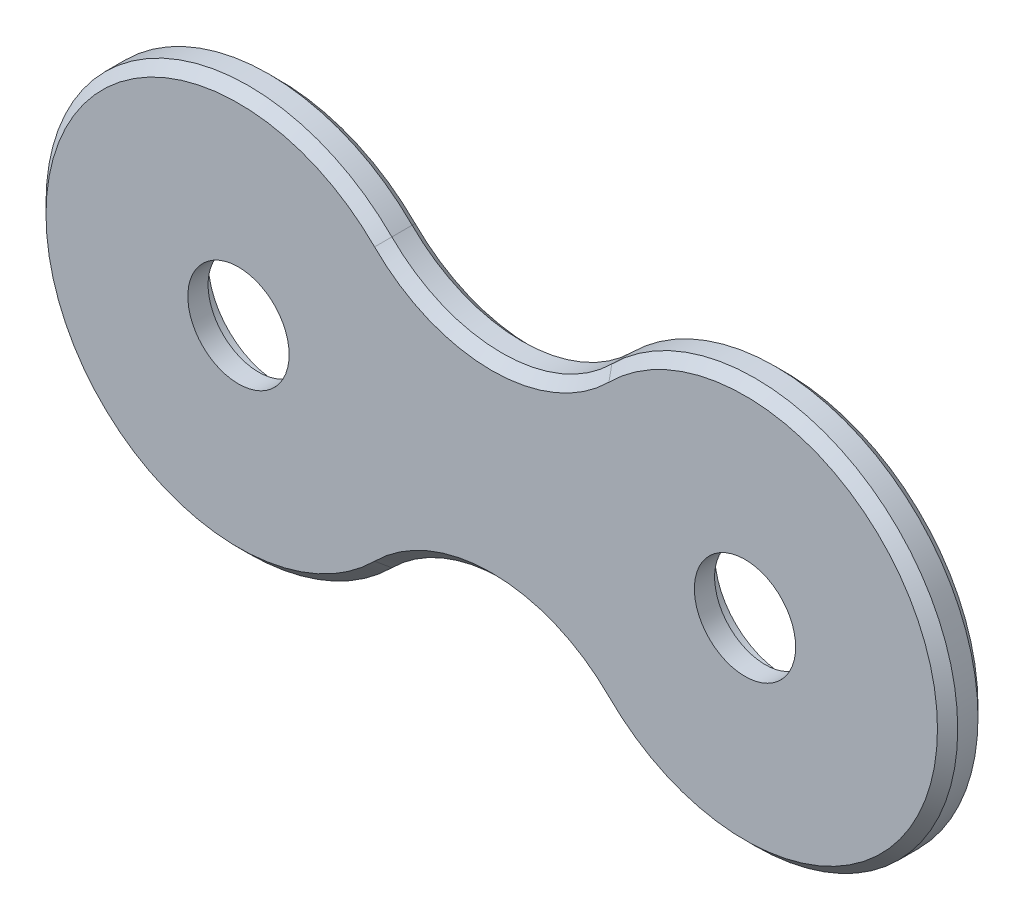
ISO-10303-21;
HEADER;
FILE_DESCRIPTION(('STEP AP214'),'2;1');
FILE_NAME('part.step','',(''),(''),'','','');
FILE_SCHEMA(('AUTOMOTIVE_DESIGN { 1 0 10303 214 1 1 1 1 }'));
ENDSEC;
DATA;
#1=APPLICATION_CONTEXT('core data for automotive mechanical design processes');
#2=APPLICATION_PROTOCOL_DEFINITION('international standard','automotive_design',2000,#1);
#3=PRODUCT_CONTEXT('',#1,'mechanical');
#4=PRODUCT('Part','Part','',(#3));
#5=PRODUCT_RELATED_PRODUCT_CATEGORY('part','',(#4));
#6=PRODUCT_DEFINITION_FORMATION('','',#4);
#7=PRODUCT_DEFINITION_CONTEXT('part definition',#1,'design');
#8=PRODUCT_DEFINITION('design','',#6,#7);
#9=PRODUCT_DEFINITION_SHAPE('','',#8);
#10=(LENGTH_UNIT() NAMED_UNIT(*) SI_UNIT(.MILLI.,.METRE.));
#11=(NAMED_UNIT(*) PLANE_ANGLE_UNIT() SI_UNIT($,.RADIAN.));
#12=(NAMED_UNIT(*) SI_UNIT($,.STERADIAN.) SOLID_ANGLE_UNIT());
#13=UNCERTAINTY_MEASURE_WITH_UNIT(LENGTH_MEASURE(1.E-05),#10,'distance_accuracy_value','');
#14=(GEOMETRIC_REPRESENTATION_CONTEXT(3) GLOBAL_UNCERTAINTY_ASSIGNED_CONTEXT((#13)) GLOBAL_UNIT_ASSIGNED_CONTEXT((#10,
#11,#12)) REPRESENTATION_CONTEXT('',''));
#15=CARTESIAN_POINT('',(0.,0.,0.));
#16=DIRECTION('',(0.,0.,1.));
#17=DIRECTION('',(1.,0.,0.));
#18=AXIS2_PLACEMENT_3D('',#15,#16,#17);
#19=CARTESIAN_POINT('',(18.75,6.25,0.));
#20=DIRECTION('',(0.,0.,1.));
#21=DIRECTION('',(1.,0.,0.));
#22=AXIS2_PLACEMENT_3D('',#19,#20,#21);
#23=PLANE('',#22);
#24=CARTESIAN_POINT('',(0.,0.,0.));
#25=DIRECTION('',(0.,0.,1.));
#26=DIRECTION('',(1.,0.,0.));
#27=AXIS2_PLACEMENT_3D('',#24,#25,#26);
#28=CIRCLE('',#27,3.5);
#29=CARTESIAN_POINT('',(3.5,0.,0.));
#30=VERTEX_POINT('',#29);
#31=EDGE_CURVE('E174',#30,#30,#28,.T.);
#32=ORIENTED_EDGE('',*,*,#31,.T.);
#33=EDGE_LOOP('',(#32));
#34=FACE_BOUND('',#33,.T.);
#35=CARTESIAN_POINT('',(12.5,-12.5,0.));
#36=DIRECTION('',(0.,0.,1.));
#37=DIRECTION('',(1.,0.,0.));
#38=AXIS2_PLACEMENT_3D('',#35,#36,#37);
#39=CIRCLE('',#38,8.17766952966369);
#40=CARTESIAN_POINT('',(18.2824855787278,-6.7175144212722,0.));
#41=VERTEX_POINT('',#40);
#42=CARTESIAN_POINT('',(6.7175144212722,-6.7175144212722,0.));
#43=VERTEX_POINT('',#42);
#44=EDGE_CURVE('E42',#41,#43,#39,.T.);
#45=ORIENTED_EDGE('',*,*,#44,.T.);
#46=CARTESIAN_POINT('',(0.,0.,0.));
#47=DIRECTION('',(0.,0.,1.));
#48=DIRECTION('',(1.,0.,0.));
#49=AXIS2_PLACEMENT_3D('',#46,#47,#48);
#50=CIRCLE('',#49,9.49999999999999);
#51=CARTESIAN_POINT('',(6.7175144212722,6.7175144212722,0.));
#52=VERTEX_POINT('',#51);
#53=EDGE_CURVE('E11',#43,#52,#50,.F.);
#54=ORIENTED_EDGE('',*,*,#53,.T.);
#55=CARTESIAN_POINT('',(12.5,12.5,0.));
#56=DIRECTION('',(0.,0.,1.));
#57=DIRECTION('',(1.,0.,0.));
#58=AXIS2_PLACEMENT_3D('',#55,#56,#57);
#59=CIRCLE('',#58,8.17766952966369);
#60=CARTESIAN_POINT('',(18.2824855787278,6.7175144212722,0.));
#61=VERTEX_POINT('',#60);
#62=EDGE_CURVE('E151',#52,#61,#59,.T.);
#63=ORIENTED_EDGE('',*,*,#62,.T.);
#64=CARTESIAN_POINT('',(25.,0.,0.));
#65=DIRECTION('',(0.,0.,1.));
#66=DIRECTION('',(1.,0.,0.));
#67=AXIS2_PLACEMENT_3D('',#64,#65,#66);
#68=CIRCLE('',#67,9.49999999999999);
#69=EDGE_CURVE('E53',#61,#41,#68,.F.);
#70=ORIENTED_EDGE('',*,*,#69,.T.);
#71=EDGE_LOOP('',(#45,#54,#63,#70));
#72=FACE_BOUND('',#71,.T.);
#73=CARTESIAN_POINT('',(25.,0.,0.));
#74=DIRECTION('',(0.,0.,1.));
#75=DIRECTION('',(1.,0.,0.));
#76=AXIS2_PLACEMENT_3D('',#73,#74,#75);
#77=CIRCLE('',#76,3.5);
#78=CARTESIAN_POINT('',(28.5,0.,0.));
#79=VERTEX_POINT('',#78);
#80=EDGE_CURVE('E181',#79,#79,#77,.T.);
#81=ORIENTED_EDGE('',*,*,#80,.T.);
#82=EDGE_LOOP('',(#81));
#83=FACE_BOUND('',#82,.T.);
#84=ADVANCED_FACE('F33',(#34,#72,#83),#23,.F.);
#85=CARTESIAN_POINT('',(18.75,6.25,2.));
#86=DIRECTION('',(0.,0.,1.));
#87=DIRECTION('',(1.,0.,0.));
#88=AXIS2_PLACEMENT_3D('',#85,#86,#87);
#89=PLANE('',#88);
#90=CARTESIAN_POINT('',(12.5,12.5,2.));
#91=DIRECTION('',(0.,0.,1.));
#92=DIRECTION('',(1.,0.,0.));
#93=AXIS2_PLACEMENT_3D('',#90,#91,#92);
#94=CIRCLE('',#93,8.17766952966369);
#95=CARTESIAN_POINT('',(18.2824855787278,6.71751442127221,2.));
#96=VERTEX_POINT('',#95);
#97=CARTESIAN_POINT('',(6.7175144212722,6.7175144212722,2.));
#98=VERTEX_POINT('',#97);
#99=EDGE_CURVE('E103',#96,#98,#94,.F.);
#100=ORIENTED_EDGE('',*,*,#99,.T.);
#101=CARTESIAN_POINT('',(0.,0.,2.));
#102=DIRECTION('',(0.,0.,1.));
#103=DIRECTION('',(1.,0.,0.));
#104=AXIS2_PLACEMENT_3D('',#101,#102,#103);
#105=CIRCLE('',#104,9.5);
#106=CARTESIAN_POINT('',(6.7175144212722,-6.7175144212722,2.));
#107=VERTEX_POINT('',#106);
#108=EDGE_CURVE('E132',#98,#107,#105,.T.);
#109=ORIENTED_EDGE('',*,*,#108,.T.);
#110=CARTESIAN_POINT('',(12.5,-12.5,2.));
#111=DIRECTION('',(0.,0.,1.));
#112=DIRECTION('',(1.,0.,0.));
#113=AXIS2_PLACEMENT_3D('',#110,#111,#112);
#114=CIRCLE('',#113,8.17766952966369);
#115=CARTESIAN_POINT('',(18.2824855787278,-6.7175144212722,2.));
#116=VERTEX_POINT('',#115);
#117=EDGE_CURVE('E106',#107,#116,#114,.F.);
#118=ORIENTED_EDGE('',*,*,#117,.T.);
#119=CARTESIAN_POINT('',(25.,0.,2.));
#120=DIRECTION('',(0.,0.,1.));
#121=DIRECTION('',(1.,0.,0.));
#122=AXIS2_PLACEMENT_3D('',#119,#120,#121);
#123=CIRCLE('',#122,9.50000000000001);
#124=EDGE_CURVE('E97',#116,#96,#123,.T.);
#125=ORIENTED_EDGE('',*,*,#124,.T.);
#126=EDGE_LOOP('',(#100,#109,#118,#125));
#127=FACE_BOUND('',#126,.T.);
#128=CARTESIAN_POINT('',(25.,0.,2.));
#129=DIRECTION('',(0.,0.,1.));
#130=DIRECTION('',(1.,0.,0.));
#131=AXIS2_PLACEMENT_3D('',#128,#129,#130);
#132=CIRCLE('',#131,2.5);
#133=CARTESIAN_POINT('',(27.5,0.,2.));
#134=VERTEX_POINT('',#133);
#135=EDGE_CURVE('E186',#134,#134,#132,.T.);
#136=ORIENTED_EDGE('',*,*,#135,.F.);
#137=EDGE_LOOP('',(#136));
#138=FACE_BOUND('',#137,.T.);
#139=CARTESIAN_POINT('',(0.,0.,2.));
#140=DIRECTION('',(0.,0.,1.));
#141=DIRECTION('',(1.,0.,0.));
#142=AXIS2_PLACEMENT_3D('',#139,#140,#141);
#143=CIRCLE('',#142,2.5);
#144=CARTESIAN_POINT('',(2.5,0.,2.));
#145=VERTEX_POINT('',#144);
#146=EDGE_CURVE('E118',#145,#145,#143,.T.);
#147=ORIENTED_EDGE('',*,*,#146,.F.);
#148=EDGE_LOOP('',(#147));
#149=FACE_BOUND('',#148,.T.);
#150=ADVANCED_FACE('F99',(#127,#138,#149),#89,.T.);
#151=CARTESIAN_POINT('',(12.5,12.5,2.));
#152=DIRECTION('',(0.,0.,-1.));
#153=DIRECTION('',(-1.,0.,0.));
#154=AXIS2_PLACEMENT_3D('',#151,#152,#153);
#155=CYLINDRICAL_SURFACE('',#154,7.67766952966369);
#156=DIRECTION('',(0.,0.,-1.));
#157=VECTOR('',#156,1.);
#158=CARTESIAN_POINT('',(7.07106781186547,7.07106781186547,2.));
#159=LINE('',#158,#157);
#160=CARTESIAN_POINT('',(7.07106781186547,7.07106781186547,1.50000000000001));
#161=VERTEX_POINT('',#160);
#162=CARTESIAN_POINT('',(7.07106781186547,7.07106781186547,0.500000000000001));
#163=VERTEX_POINT('',#162);
#164=EDGE_CURVE('E124',#161,#163,#159,.T.);
#165=ORIENTED_EDGE('',*,*,#164,.F.);
#166=CARTESIAN_POINT('',(12.5,12.5,1.50000000000001));
#167=DIRECTION('',(0.,0.,1.));
#168=DIRECTION('',(1.,0.,0.));
#169=AXIS2_PLACEMENT_3D('',#166,#167,#168);
#170=CIRCLE('',#169,7.67766952966369);
#171=CARTESIAN_POINT('',(17.9289321881345,7.07106781186548,1.50000000000001));
#172=VERTEX_POINT('',#171);
#173=EDGE_CURVE('E149',#161,#172,#170,.T.);
#174=ORIENTED_EDGE('',*,*,#173,.T.);
#175=DIRECTION('',(0.,0.,-1.));
#176=VECTOR('',#175,1.);
#177=CARTESIAN_POINT('',(17.9289321881345,7.07106781186548,2.));
#178=LINE('',#177,#176);
#179=CARTESIAN_POINT('',(17.9289321881345,7.07106781186548,0.500000000000001));
#180=VERTEX_POINT('',#179);
#181=EDGE_CURVE('E189',#172,#180,#178,.T.);
#182=ORIENTED_EDGE('',*,*,#181,.T.);
#183=CARTESIAN_POINT('',(12.5,12.5,0.500000000000001));
#184=DIRECTION('',(0.,0.,1.));
#185=DIRECTION('',(1.,0.,0.));
#186=AXIS2_PLACEMENT_3D('',#183,#184,#185);
#187=CIRCLE('',#186,7.67766952966369);
#188=EDGE_CURVE('E147',#180,#163,#187,.F.);
#189=ORIENTED_EDGE('',*,*,#188,.T.);
#190=EDGE_LOOP('',(#165,#174,#182,#189));
#191=FACE_BOUND('',#190,.T.);
#192=ADVANCED_FACE('F225',(#191),#155,.F.);
#193=CARTESIAN_POINT('',(0.,0.,2.));
#194=DIRECTION('',(0.,0.,-1.));
#195=DIRECTION('',(-1.,0.,0.));
#196=AXIS2_PLACEMENT_3D('',#193,#194,#195);
#197=CYLINDRICAL_SURFACE('',#196,10.);
#198=DIRECTION('',(0.,0.,-1.));
#199=VECTOR('',#198,1.);
#200=CARTESIAN_POINT('',(7.07106781186547,-7.07106781186547,2.));
#201=LINE('',#200,#199);
#202=CARTESIAN_POINT('',(7.07106781186547,-7.07106781186547,1.50000000000001));
#203=VERTEX_POINT('',#202);
#204=CARTESIAN_POINT('',(7.07106781186547,-7.07106781186547,0.500000000000001));
#205=VERTEX_POINT('',#204);
#206=EDGE_CURVE('E127',#203,#205,#201,.T.);
#207=ORIENTED_EDGE('',*,*,#206,.F.);
#208=CARTESIAN_POINT('',(0.,0.,1.50000000000001));
#209=DIRECTION('',(0.,0.,1.));
#210=DIRECTION('',(1.,0.,0.));
#211=AXIS2_PLACEMENT_3D('',#208,#209,#210);
#212=CIRCLE('',#211,10.);
#213=EDGE_CURVE('E137',#203,#161,#212,.F.);
#214=ORIENTED_EDGE('',*,*,#213,.T.);
#215=ORIENTED_EDGE('',*,*,#164,.T.);
#216=CARTESIAN_POINT('',(0.,0.,0.500000000000001));
#217=DIRECTION('',(0.,0.,1.));
#218=DIRECTION('',(1.,0.,0.));
#219=AXIS2_PLACEMENT_3D('',#216,#217,#218);
#220=CIRCLE('',#219,10.);
#221=EDGE_CURVE('E134',#163,#205,#220,.T.);
#222=ORIENTED_EDGE('',*,*,#221,.T.);
#223=EDGE_LOOP('',(#207,#214,#215,#222));
#224=FACE_BOUND('',#223,.T.);
#225=ADVANCED_FACE('F203',(#224),#197,.T.);
#226=CARTESIAN_POINT('',(12.5,-12.5,2.));
#227=DIRECTION('',(0.,0.,-1.));
#228=DIRECTION('',(-1.,0.,0.));
#229=AXIS2_PLACEMENT_3D('',#226,#227,#228);
#230=CYLINDRICAL_SURFACE('',#229,7.67766952966369);
#231=DIRECTION('',(0.,0.,-1.));
#232=VECTOR('',#231,1.);
#233=CARTESIAN_POINT('',(17.9289321881345,-7.07106781186547,2.));
#234=LINE('',#233,#232);
#235=CARTESIAN_POINT('',(17.9289321881345,-7.07106781186547,1.50000000000001));
#236=VERTEX_POINT('',#235);
#237=CARTESIAN_POINT('',(17.9289321881345,-7.07106781186547,0.500000000000001));
#238=VERTEX_POINT('',#237);
#239=EDGE_CURVE('E192',#236,#238,#234,.T.);
#240=ORIENTED_EDGE('',*,*,#239,.F.);
#241=CARTESIAN_POINT('',(12.5,-12.5,1.50000000000001));
#242=DIRECTION('',(0.,0.,1.));
#243=DIRECTION('',(1.,0.,0.));
#244=AXIS2_PLACEMENT_3D('',#241,#242,#243);
#245=CIRCLE('',#244,7.67766952966369);
#246=EDGE_CURVE('E142',#236,#203,#245,.T.);
#247=ORIENTED_EDGE('',*,*,#246,.T.);
#248=ORIENTED_EDGE('',*,*,#206,.T.);
#249=CARTESIAN_POINT('',(12.5,-12.5,0.500000000000001));
#250=DIRECTION('',(0.,0.,1.));
#251=DIRECTION('',(1.,0.,0.));
#252=AXIS2_PLACEMENT_3D('',#249,#250,#251);
#253=CIRCLE('',#252,7.67766952966369);
#254=EDGE_CURVE('E140',#205,#238,#253,.F.);
#255=ORIENTED_EDGE('',*,*,#254,.T.);
#256=EDGE_LOOP('',(#240,#247,#248,#255));
#257=FACE_BOUND('',#256,.T.);
#258=ADVANCED_FACE('F198',(#257),#230,.F.);
#259=CARTESIAN_POINT('',(25.,0.,2.));
#260=DIRECTION('',(0.,0.,-1.));
#261=DIRECTION('',(-1.,0.,0.));
#262=AXIS2_PLACEMENT_3D('',#259,#260,#261);
#263=CYLINDRICAL_SURFACE('',#262,10.);
#264=ORIENTED_EDGE('',*,*,#181,.F.);
#265=CARTESIAN_POINT('',(25.,0.,1.50000000000001));
#266=DIRECTION('',(0.,0.,1.));
#267=DIRECTION('',(1.,0.,0.));
#268=AXIS2_PLACEMENT_3D('',#265,#266,#267);
#269=CIRCLE('',#268,10.);
#270=EDGE_CURVE('E115',#172,#236,#269,.F.);
#271=ORIENTED_EDGE('',*,*,#270,.T.);
#272=ORIENTED_EDGE('',*,*,#239,.T.);
#273=CARTESIAN_POINT('',(25.,0.,0.500000000000001));
#274=DIRECTION('',(0.,0.,1.));
#275=DIRECTION('',(1.,0.,0.));
#276=AXIS2_PLACEMENT_3D('',#273,#274,#275);
#277=CIRCLE('',#276,10.);
#278=EDGE_CURVE('E144',#238,#180,#277,.T.);
#279=ORIENTED_EDGE('',*,*,#278,.T.);
#280=EDGE_LOOP('',(#264,#271,#272,#279));
#281=FACE_BOUND('',#280,.T.);
#282=ADVANCED_FACE('F229',(#281),#263,.T.);
#283=CARTESIAN_POINT('',(25.,0.,2.));
#284=DIRECTION('',(0.,0.,-1.));
#285=DIRECTION('',(-1.,0.,0.));
#286=AXIS2_PLACEMENT_3D('',#283,#284,#285);
#287=CYLINDRICAL_SURFACE('',#286,2.5);
#288=CARTESIAN_POINT('',(25.,0.,1.));
#289=DIRECTION('',(0.,0.,1.));
#290=DIRECTION('',(1.,0.,0.));
#291=AXIS2_PLACEMENT_3D('',#288,#289,#290);
#292=CIRCLE('',#291,2.5);
#293=CARTESIAN_POINT('',(27.5,0.,1.));
#294=VERTEX_POINT('',#293);
#295=EDGE_CURVE('E37',#294,#294,#292,.T.);
#296=ORIENTED_EDGE('',*,*,#295,.F.);
#297=EDGE_LOOP('',(#296));
#298=FACE_BOUND('',#297,.T.);
#299=ORIENTED_EDGE('',*,*,#135,.T.);
#300=EDGE_LOOP('',(#299));
#301=FACE_BOUND('',#300,.T.);
#302=ADVANCED_FACE('F232',(#298,#301),#287,.F.);
#303=CARTESIAN_POINT('',(0.,0.,2.));
#304=DIRECTION('',(0.,0.,-1.));
#305=DIRECTION('',(-1.,0.,0.));
#306=AXIS2_PLACEMENT_3D('',#303,#304,#305);
#307=CYLINDRICAL_SURFACE('',#306,2.5);
#308=CARTESIAN_POINT('',(0.,0.,1.));
#309=DIRECTION('',(0.,0.,1.));
#310=DIRECTION('',(1.,0.,0.));
#311=AXIS2_PLACEMENT_3D('',#308,#309,#310);
#312=CIRCLE('',#311,2.5);
#313=CARTESIAN_POINT('',(2.5,0.,1.));
#314=VERTEX_POINT('',#313);
#315=EDGE_CURVE('E163',#314,#314,#312,.T.);
#316=ORIENTED_EDGE('',*,*,#315,.F.);
#317=EDGE_LOOP('',(#316));
#318=FACE_BOUND('',#317,.T.);
#319=ORIENTED_EDGE('',*,*,#146,.T.);
#320=EDGE_LOOP('',(#319));
#321=FACE_BOUND('',#320,.T.);
#322=ADVANCED_FACE('F269',(#318,#321),#307,.F.);
#323=CARTESIAN_POINT('',(25.,0.,2.));
#324=DIRECTION('',(0.,0.,-1.));
#325=DIRECTION('',(-1.,0.,0.));
#326=AXIS2_PLACEMENT_3D('',#323,#324,#325);
#327=CONICAL_SURFACE('',#326,9.50000000000001,0.785398163397448);
#328=DIRECTION('',(0.499999999999999,0.500000000000003,0.707106781186546));
#329=VECTOR('',#328,1.);
#330=CARTESIAN_POINT('',(17.9289321881345,-7.07106781186547,1.50000000000001));
#331=LINE('',#330,#329);
#332=EDGE_CURVE('E119',#236,#116,#331,.T.);
#333=ORIENTED_EDGE('',*,*,#332,.F.);
#334=ORIENTED_EDGE('',*,*,#270,.F.);
#335=DIRECTION('',(-0.5,0.500000000000001,-0.707106781186547));
#336=VECTOR('',#335,1.);
#337=CARTESIAN_POINT('',(18.2824855787278,6.71751442127221,2.));
#338=LINE('',#337,#336);
#339=EDGE_CURVE('E113',#96,#172,#338,.T.);
#340=ORIENTED_EDGE('',*,*,#339,.F.);
#341=ORIENTED_EDGE('',*,*,#124,.F.);
#342=EDGE_LOOP('',(#333,#334,#340,#341));
#343=FACE_BOUND('',#342,.T.);
#344=ADVANCED_FACE('F114',(#343),#327,.T.);
#345=CARTESIAN_POINT('',(12.5,12.5,2.));
#346=DIRECTION('',(0.,0.,1.));
#347=DIRECTION('',(1.,0.,0.));
#348=AXIS2_PLACEMENT_3D('',#345,#346,#347);
#349=CONICAL_SURFACE('',#348,8.17766952966369,0.785398163397451);
#350=ORIENTED_EDGE('',*,*,#339,.T.);
#351=ORIENTED_EDGE('',*,*,#173,.F.);
#352=DIRECTION('',(0.500000000000001,0.5,-0.707106781186546));
#353=VECTOR('',#352,1.);
#354=CARTESIAN_POINT('',(6.7175144212722,6.7175144212722,2.));
#355=LINE('',#354,#353);
#356=EDGE_CURVE('E122',#98,#161,#355,.T.);
#357=ORIENTED_EDGE('',*,*,#356,.F.);
#358=ORIENTED_EDGE('',*,*,#99,.F.);
#359=EDGE_LOOP('',(#350,#351,#357,#358));
#360=FACE_BOUND('',#359,.T.);
#361=ADVANCED_FACE('F121',(#360),#349,.F.);
#362=CARTESIAN_POINT('',(12.5,-12.5,2.));
#363=DIRECTION('',(0.,0.,1.));
#364=DIRECTION('',(1.,0.,0.));
#365=AXIS2_PLACEMENT_3D('',#362,#363,#364);
#366=CONICAL_SURFACE('',#365,8.17766952966369,0.785398163397449);
#367=ORIENTED_EDGE('',*,*,#332,.T.);
#368=ORIENTED_EDGE('',*,*,#117,.F.);
#369=DIRECTION('',(-0.500000000000001,0.5,0.707106781186547));
#370=VECTOR('',#369,1.);
#371=CARTESIAN_POINT('',(7.07106781186547,-7.07106781186547,1.50000000000001));
#372=LINE('',#371,#370);
#373=EDGE_CURVE('E155',#203,#107,#372,.T.);
#374=ORIENTED_EDGE('',*,*,#373,.F.);
#375=ORIENTED_EDGE('',*,*,#246,.F.);
#376=EDGE_LOOP('',(#367,#368,#374,#375));
#377=FACE_BOUND('',#376,.T.);
#378=ADVANCED_FACE('F210',(#377),#366,.F.);
#379=CARTESIAN_POINT('',(0.,0.,2.));
#380=DIRECTION('',(0.,0.,-1.));
#381=DIRECTION('',(-1.,0.,0.));
#382=AXIS2_PLACEMENT_3D('',#379,#380,#381);
#383=CONICAL_SURFACE('',#382,9.5,0.78539816339745);
#384=ORIENTED_EDGE('',*,*,#356,.T.);
#385=ORIENTED_EDGE('',*,*,#213,.F.);
#386=ORIENTED_EDGE('',*,*,#373,.T.);
#387=ORIENTED_EDGE('',*,*,#108,.F.);
#388=EDGE_LOOP('',(#384,#385,#386,#387));
#389=FACE_BOUND('',#388,.T.);
#390=ADVANCED_FACE('F208',(#389),#383,.T.);
#391=CARTESIAN_POINT('',(25.,0.,0.500000000000001));
#392=DIRECTION('',(0.,0.,1.));
#393=DIRECTION('',(1.,0.,0.));
#394=AXIS2_PLACEMENT_3D('',#391,#392,#393);
#395=CONICAL_SURFACE('',#394,10.,0.785398163397451);
#396=DIRECTION('',(-0.500000000000001,-0.500000000000001,0.707106781186546));
#397=VECTOR('',#396,1.);
#398=CARTESIAN_POINT('',(18.2824855787278,-6.7175144212722,0.));
#399=LINE('',#398,#397);
#400=EDGE_CURVE('E165',#41,#238,#399,.T.);
#401=ORIENTED_EDGE('',*,*,#400,.F.);
#402=ORIENTED_EDGE('',*,*,#69,.F.);
#403=DIRECTION('',(0.500000000000001,-0.500000000000001,-0.707106781186546));
#404=VECTOR('',#403,1.);
#405=CARTESIAN_POINT('',(17.9289321881345,7.07106781186548,0.500000000000001));
#406=LINE('',#405,#404);
#407=EDGE_CURVE('E157',#180,#61,#406,.T.);
#408=ORIENTED_EDGE('',*,*,#407,.F.);
#409=ORIENTED_EDGE('',*,*,#278,.F.);
#410=EDGE_LOOP('',(#401,#402,#408,#409));
#411=FACE_BOUND('',#410,.T.);
#412=ADVANCED_FACE('F35',(#411),#395,.T.);
#413=CARTESIAN_POINT('',(12.5,12.5,0.500000000000001));
#414=DIRECTION('',(0.,0.,-1.));
#415=DIRECTION('',(-1.,0.,0.));
#416=AXIS2_PLACEMENT_3D('',#413,#414,#415);
#417=CONICAL_SURFACE('',#416,7.67766952966369,0.78539816339745);
#418=ORIENTED_EDGE('',*,*,#407,.T.);
#419=ORIENTED_EDGE('',*,*,#62,.F.);
#420=DIRECTION('',(-0.500000000000002,-0.500000000000002,-0.707106781186545));
#421=VECTOR('',#420,1.);
#422=CARTESIAN_POINT('',(7.07106781186548,7.07106781186547,0.500000000000001));
#423=LINE('',#422,#421);
#424=EDGE_CURVE('E162',#163,#52,#423,.T.);
#425=ORIENTED_EDGE('',*,*,#424,.F.);
#426=ORIENTED_EDGE('',*,*,#188,.F.);
#427=EDGE_LOOP('',(#418,#419,#425,#426));
#428=FACE_BOUND('',#427,.T.);
#429=ADVANCED_FACE('F247',(#428),#417,.F.);
#430=CARTESIAN_POINT('',(12.5,-12.5,0.500000000000001));
#431=DIRECTION('',(0.,0.,-1.));
#432=DIRECTION('',(-1.,0.,0.));
#433=AXIS2_PLACEMENT_3D('',#430,#431,#432);
#434=CONICAL_SURFACE('',#433,7.67766952966369,0.78539816339745);
#435=ORIENTED_EDGE('',*,*,#400,.T.);
#436=ORIENTED_EDGE('',*,*,#254,.F.);
#437=DIRECTION('',(0.500000000000002,-0.500000000000002,0.707106781186545));
#438=VECTOR('',#437,1.);
#439=CARTESIAN_POINT('',(6.7175144212722,-6.7175144212722,0.));
#440=LINE('',#439,#438);
#441=EDGE_CURVE('E160',#43,#205,#440,.T.);
#442=ORIENTED_EDGE('',*,*,#441,.F.);
#443=ORIENTED_EDGE('',*,*,#44,.F.);
#444=EDGE_LOOP('',(#435,#436,#442,#443));
#445=FACE_BOUND('',#444,.T.);
#446=ADVANCED_FACE('F252',(#445),#434,.F.);
#447=CARTESIAN_POINT('',(0.,0.,0.500000000000001));
#448=DIRECTION('',(0.,0.,1.));
#449=DIRECTION('',(1.,0.,0.));
#450=AXIS2_PLACEMENT_3D('',#447,#448,#449);
#451=CONICAL_SURFACE('',#450,10.,0.785398163397451);
#452=ORIENTED_EDGE('',*,*,#424,.T.);
#453=ORIENTED_EDGE('',*,*,#53,.F.);
#454=ORIENTED_EDGE('',*,*,#441,.T.);
#455=ORIENTED_EDGE('',*,*,#221,.F.);
#456=EDGE_LOOP('',(#452,#453,#454,#455));
#457=FACE_BOUND('',#456,.T.);
#458=ADVANCED_FACE('F249',(#457),#451,.T.);
#459=CARTESIAN_POINT('',(0.,0.,1.));
#460=DIRECTION('',(0.,0.,-1.));
#461=DIRECTION('',(-1.,0.,0.));
#462=AXIS2_PLACEMENT_3D('',#459,#460,#461);
#463=CYLINDRICAL_SURFACE('',#462,3.5);
#464=CARTESIAN_POINT('',(0.,0.,1.));
#465=DIRECTION('',(0.,0.,1.));
#466=DIRECTION('',(1.,0.,0.));
#467=AXIS2_PLACEMENT_3D('',#464,#465,#466);
#468=CIRCLE('',#467,3.5);
#469=CARTESIAN_POINT('',(3.5,0.,1.));
#470=VERTEX_POINT('',#469);
#471=EDGE_CURVE('E170',#470,#470,#468,.T.);
#472=ORIENTED_EDGE('',*,*,#471,.T.);
#473=EDGE_LOOP('',(#472));
#474=FACE_BOUND('',#473,.T.);
#475=ORIENTED_EDGE('',*,*,#31,.F.);
#476=EDGE_LOOP('',(#475));
#477=FACE_BOUND('',#476,.T.);
#478=ADVANCED_FACE('F267',(#474,#477),#463,.F.);
#479=CARTESIAN_POINT('',(0.,0.,1.));
#480=DIRECTION('',(0.,0.,1.));
#481=DIRECTION('',(1.,0.,0.));
#482=AXIS2_PLACEMENT_3D('',#479,#480,#481);
#483=PLANE('',#482);
#484=ORIENTED_EDGE('',*,*,#315,.T.);
#485=EDGE_LOOP('',(#484));
#486=FACE_BOUND('',#485,.T.);
#487=ORIENTED_EDGE('',*,*,#471,.F.);
#488=EDGE_LOOP('',(#487));
#489=FACE_BOUND('',#488,.T.);
#490=ADVANCED_FACE('F283',(#486,#489),#483,.F.);
#491=CARTESIAN_POINT('',(25.,0.,1.));
#492=DIRECTION('',(0.,0.,-1.));
#493=DIRECTION('',(-1.,0.,0.));
#494=AXIS2_PLACEMENT_3D('',#491,#492,#493);
#495=CYLINDRICAL_SURFACE('',#494,3.5);
#496=CARTESIAN_POINT('',(25.,0.,1.));
#497=DIRECTION('',(0.,0.,1.));
#498=DIRECTION('',(1.,0.,0.));
#499=AXIS2_PLACEMENT_3D('',#496,#497,#498);
#500=CIRCLE('',#499,3.5);
#501=CARTESIAN_POINT('',(28.5,0.,1.));
#502=VERTEX_POINT('',#501);
#503=EDGE_CURVE('E300',#502,#502,#500,.T.);
#504=ORIENTED_EDGE('',*,*,#503,.T.);
#505=EDGE_LOOP('',(#504));
#506=FACE_BOUND('',#505,.T.);
#507=ORIENTED_EDGE('',*,*,#80,.F.);
#508=EDGE_LOOP('',(#507));
#509=FACE_BOUND('',#508,.T.);
#510=ADVANCED_FACE('F286',(#506,#509),#495,.F.);
#511=CARTESIAN_POINT('',(25.,0.,1.));
#512=DIRECTION('',(0.,0.,1.));
#513=DIRECTION('',(1.,0.,0.));
#514=AXIS2_PLACEMENT_3D('',#511,#512,#513);
#515=PLANE('',#514);
#516=ORIENTED_EDGE('',*,*,#295,.T.);
#517=EDGE_LOOP('',(#516));
#518=FACE_BOUND('',#517,.T.);
#519=ORIENTED_EDGE('',*,*,#503,.F.);
#520=EDGE_LOOP('',(#519));
#521=FACE_BOUND('',#520,.T.);
#522=ADVANCED_FACE('F289',(#518,#521),#515,.F.);
#523=CLOSED_SHELL('',(#84,#150,#192,#225,#258,#282,#302,#322,#344,#361,#378,#390,#412,#429,#446,
#458,#478,#490,#510,#522));
#524=MANIFOLD_SOLID_BREP('B2',#523);
#525=ADVANCED_BREP_SHAPE_REPRESENTATION('',(#18,#524),#14);
#526=SHAPE_DEFINITION_REPRESENTATION(#9,#525);
ENDSEC;
END-ISO-10303-21;
